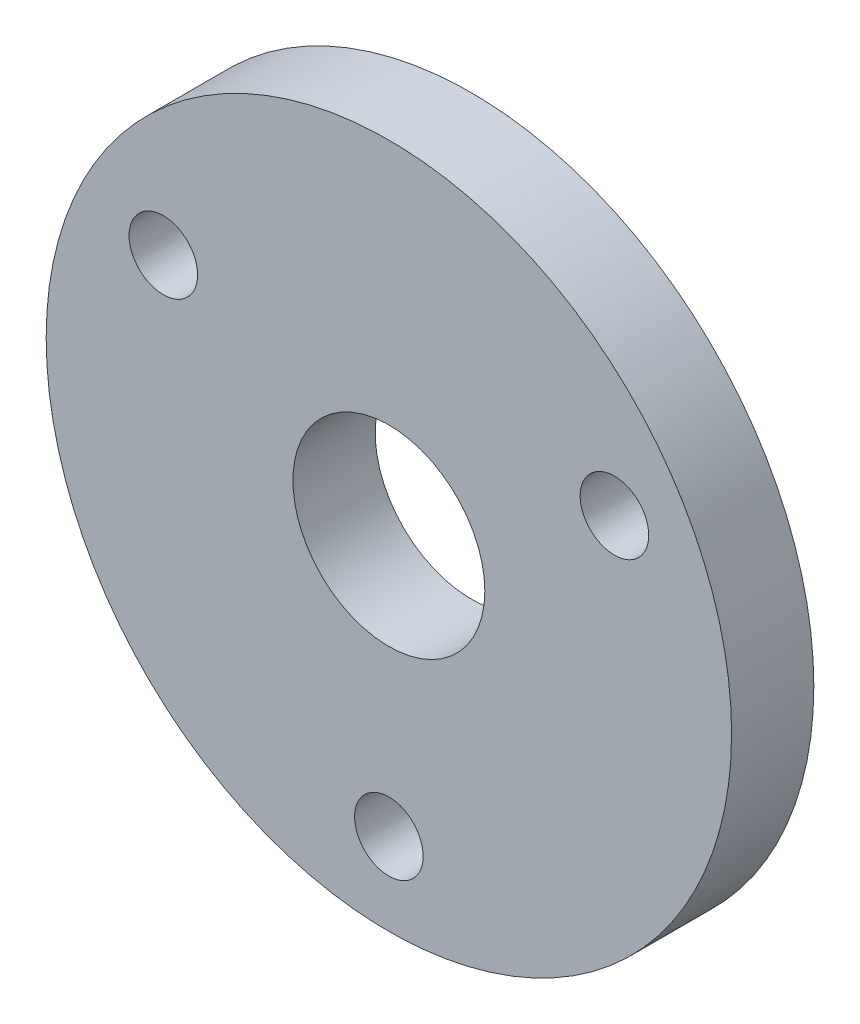
ISO-10303-21;
HEADER;
FILE_DESCRIPTION(('STEP AP214'),'2;1');
FILE_NAME('part.step','',(''),(''),'','','');
FILE_SCHEMA(('AUTOMOTIVE_DESIGN { 1 0 10303 214 1 1 1 1 }'));
ENDSEC;
DATA;
#1=APPLICATION_CONTEXT('core data for automotive mechanical design processes');
#2=APPLICATION_PROTOCOL_DEFINITION('international standard','automotive_design',2000,#1);
#3=PRODUCT_CONTEXT('',#1,'mechanical');
#4=PRODUCT('Part','Part','',(#3));
#5=PRODUCT_RELATED_PRODUCT_CATEGORY('part','',(#4));
#6=PRODUCT_DEFINITION_FORMATION('','',#4);
#7=PRODUCT_DEFINITION_CONTEXT('part definition',#1,'design');
#8=PRODUCT_DEFINITION('design','',#6,#7);
#9=PRODUCT_DEFINITION_SHAPE('','',#8);
#10=(LENGTH_UNIT() NAMED_UNIT(*) SI_UNIT(.MILLI.,.METRE.));
#11=(NAMED_UNIT(*) PLANE_ANGLE_UNIT() SI_UNIT($,.RADIAN.));
#12=(NAMED_UNIT(*) SI_UNIT($,.STERADIAN.) SOLID_ANGLE_UNIT());
#13=UNCERTAINTY_MEASURE_WITH_UNIT(LENGTH_MEASURE(1.E-05),#10,'distance_accuracy_value','');
#14=(GEOMETRIC_REPRESENTATION_CONTEXT(3) GLOBAL_UNCERTAINTY_ASSIGNED_CONTEXT((#13)) GLOBAL_UNIT_ASSIGNED_CONTEXT((#10,
#11,#12)) REPRESENTATION_CONTEXT('',''));
#15=CARTESIAN_POINT('',(0.,0.,0.));
#16=DIRECTION('',(0.,0.,1.));
#17=DIRECTION('',(1.,0.,0.));
#18=AXIS2_PLACEMENT_3D('',#15,#16,#17);
#19=CARTESIAN_POINT('',(0.,0.,6.00000000000001));
#20=DIRECTION('',(0.,0.,1.));
#21=DIRECTION('',(1.,0.,0.));
#22=AXIS2_PLACEMENT_3D('',#19,#20,#21);
#23=PLANE('',#22);
#24=CARTESIAN_POINT('',(-16.4544826719043,9.50000000000008,6.00000000000001));
#25=DIRECTION('',(0.,0.,1.));
#26=DIRECTION('',(1.,0.,0.));
#27=AXIS2_PLACEMENT_3D('',#24,#25,#26);
#28=CIRCLE('',#27,2.5);
#29=CARTESIAN_POINT('',(-13.9544826719043,9.50000000000008,6.00000000000001));
#30=VERTEX_POINT('',#29);
#31=EDGE_CURVE('E48',#30,#30,#28,.T.);
#32=ORIENTED_EDGE('',*,*,#31,.F.);
#33=EDGE_LOOP('',(#32));
#34=FACE_BOUND('',#33,.T.);
#35=CARTESIAN_POINT('',(0.,0.,6.00000000000001));
#36=DIRECTION('',(0.,0.,1.));
#37=DIRECTION('',(1.,0.,0.));
#38=AXIS2_PLACEMENT_3D('',#35,#36,#37);
#39=CIRCLE('',#38,7.);
#40=CARTESIAN_POINT('',(7.,0.,6.00000000000001));
#41=VERTEX_POINT('',#40);
#42=EDGE_CURVE('E37',#41,#41,#39,.T.);
#43=ORIENTED_EDGE('',*,*,#42,.F.);
#44=EDGE_LOOP('',(#43));
#45=FACE_BOUND('',#44,.T.);
#46=CARTESIAN_POINT('',(0.,0.,6.00000000000001));
#47=DIRECTION('',(0.,0.,1.));
#48=DIRECTION('',(1.,0.,0.));
#49=AXIS2_PLACEMENT_3D('',#46,#47,#48);
#50=CIRCLE('',#49,25.);
#51=CARTESIAN_POINT('',(25.,0.,6.00000000000001));
#52=VERTEX_POINT('',#51);
#53=EDGE_CURVE('E10',#52,#52,#50,.T.);
#54=ORIENTED_EDGE('',*,*,#53,.T.);
#55=EDGE_LOOP('',(#54));
#56=FACE_BOUND('',#55,.T.);
#57=CARTESIAN_POINT('',(0.,-19.,6.00000000000001));
#58=DIRECTION('',(0.,0.,1.));
#59=DIRECTION('',(1.,0.,0.));
#60=AXIS2_PLACEMENT_3D('',#57,#58,#59);
#61=CIRCLE('',#60,2.5);
#62=CARTESIAN_POINT('',(2.49999999999999,-19.,6.00000000000001));
#63=VERTEX_POINT('',#62);
#64=EDGE_CURVE('E42',#63,#63,#61,.T.);
#65=ORIENTED_EDGE('',*,*,#64,.F.);
#66=EDGE_LOOP('',(#65));
#67=FACE_BOUND('',#66,.T.);
#68=CARTESIAN_POINT('',(16.4544826719044,9.49999999999984,6.00000000000001));
#69=DIRECTION('',(0.,0.,1.));
#70=DIRECTION('',(1.,0.,0.));
#71=AXIS2_PLACEMENT_3D('',#68,#69,#70);
#72=CIRCLE('',#71,2.5);
#73=CARTESIAN_POINT('',(18.9544826719044,9.49999999999984,6.00000000000001));
#74=VERTEX_POINT('',#73);
#75=EDGE_CURVE('E54',#74,#74,#72,.T.);
#76=ORIENTED_EDGE('',*,*,#75,.F.);
#77=EDGE_LOOP('',(#76));
#78=FACE_BOUND('',#77,.T.);
#79=ADVANCED_FACE('F26',(#34,#45,#56,#67,#78),#23,.T.);
#80=CARTESIAN_POINT('',(0.,0.,0.));
#81=DIRECTION('',(0.,0.,1.));
#82=DIRECTION('',(1.,0.,0.));
#83=AXIS2_PLACEMENT_3D('',#80,#81,#82);
#84=PLANE('',#83);
#85=CARTESIAN_POINT('',(0.,0.,0.));
#86=DIRECTION('',(0.,0.,1.));
#87=DIRECTION('',(1.,0.,0.));
#88=AXIS2_PLACEMENT_3D('',#85,#86,#87);
#89=CIRCLE('',#88,25.);
#90=CARTESIAN_POINT('',(25.,0.,0.));
#91=VERTEX_POINT('',#90);
#92=EDGE_CURVE('E30',#91,#91,#89,.T.);
#93=ORIENTED_EDGE('',*,*,#92,.F.);
#94=EDGE_LOOP('',(#93));
#95=FACE_BOUND('',#94,.T.);
#96=CARTESIAN_POINT('',(0.,0.,0.));
#97=DIRECTION('',(0.,0.,1.));
#98=DIRECTION('',(1.,0.,0.));
#99=AXIS2_PLACEMENT_3D('',#96,#97,#98);
#100=CIRCLE('',#99,7.);
#101=CARTESIAN_POINT('',(7.,0.,0.));
#102=VERTEX_POINT('',#101);
#103=EDGE_CURVE('E39',#102,#102,#100,.T.);
#104=ORIENTED_EDGE('',*,*,#103,.T.);
#105=EDGE_LOOP('',(#104));
#106=FACE_BOUND('',#105,.T.);
#107=CARTESIAN_POINT('',(0.,-19.,0.));
#108=DIRECTION('',(0.,0.,1.));
#109=DIRECTION('',(1.,0.,0.));
#110=AXIS2_PLACEMENT_3D('',#107,#108,#109);
#111=CIRCLE('',#110,2.5);
#112=CARTESIAN_POINT('',(2.49999999999999,-19.,0.));
#113=VERTEX_POINT('',#112);
#114=EDGE_CURVE('E45',#113,#113,#111,.T.);
#115=ORIENTED_EDGE('',*,*,#114,.T.);
#116=EDGE_LOOP('',(#115));
#117=FACE_BOUND('',#116,.T.);
#118=CARTESIAN_POINT('',(-16.4544826719043,9.50000000000008,0.));
#119=DIRECTION('',(0.,0.,1.));
#120=DIRECTION('',(1.,0.,0.));
#121=AXIS2_PLACEMENT_3D('',#118,#119,#120);
#122=CIRCLE('',#121,2.5);
#123=CARTESIAN_POINT('',(-13.9544826719043,9.50000000000008,0.));
#124=VERTEX_POINT('',#123);
#125=EDGE_CURVE('E51',#124,#124,#122,.T.);
#126=ORIENTED_EDGE('',*,*,#125,.T.);
#127=EDGE_LOOP('',(#126));
#128=FACE_BOUND('',#127,.T.);
#129=CARTESIAN_POINT('',(16.4544826719044,9.49999999999984,0.));
#130=DIRECTION('',(0.,0.,1.));
#131=DIRECTION('',(1.,0.,0.));
#132=AXIS2_PLACEMENT_3D('',#129,#130,#131);
#133=CIRCLE('',#132,2.5);
#134=CARTESIAN_POINT('',(18.9544826719044,9.49999999999984,0.));
#135=VERTEX_POINT('',#134);
#136=EDGE_CURVE('E57',#135,#135,#133,.T.);
#137=ORIENTED_EDGE('',*,*,#136,.T.);
#138=EDGE_LOOP('',(#137));
#139=FACE_BOUND('',#138,.T.);
#140=ADVANCED_FACE('F67',(#95,#106,#117,#128,#139),#84,.F.);
#141=CARTESIAN_POINT('',(0.,0.,6.00000000000001));
#142=DIRECTION('',(0.,0.,-1.));
#143=DIRECTION('',(-1.,0.,0.));
#144=AXIS2_PLACEMENT_3D('',#141,#142,#143);
#145=CYLINDRICAL_SURFACE('',#144,25.);
#146=ORIENTED_EDGE('',*,*,#53,.F.);
#147=EDGE_LOOP('',(#146));
#148=FACE_BOUND('',#147,.T.);
#149=ORIENTED_EDGE('',*,*,#92,.T.);
#150=EDGE_LOOP('',(#149));
#151=FACE_BOUND('',#150,.T.);
#152=ADVANCED_FACE('F28',(#148,#151),#145,.T.);
#153=CARTESIAN_POINT('',(0.,0.,6.00000000000001));
#154=DIRECTION('',(0.,0.,-1.));
#155=DIRECTION('',(-1.,0.,0.));
#156=AXIS2_PLACEMENT_3D('',#153,#154,#155);
#157=CYLINDRICAL_SURFACE('',#156,7.);
#158=ORIENTED_EDGE('',*,*,#42,.T.);
#159=EDGE_LOOP('',(#158));
#160=FACE_BOUND('',#159,.T.);
#161=ORIENTED_EDGE('',*,*,#103,.F.);
#162=EDGE_LOOP('',(#161));
#163=FACE_BOUND('',#162,.T.);
#164=ADVANCED_FACE('F77',(#160,#163),#157,.F.);
#165=CARTESIAN_POINT('',(0.,-19.,6.00000000000001));
#166=DIRECTION('',(0.,0.,-1.));
#167=DIRECTION('',(-1.,0.,0.));
#168=AXIS2_PLACEMENT_3D('',#165,#166,#167);
#169=CYLINDRICAL_SURFACE('',#168,2.5);
#170=ORIENTED_EDGE('',*,*,#64,.T.);
#171=EDGE_LOOP('',(#170));
#172=FACE_BOUND('',#171,.T.);
#173=ORIENTED_EDGE('',*,*,#114,.F.);
#174=EDGE_LOOP('',(#173));
#175=FACE_BOUND('',#174,.T.);
#176=ADVANCED_FACE('F80',(#172,#175),#169,.F.);
#177=CARTESIAN_POINT('',(-16.4544826719043,9.50000000000008,6.00000000000001));
#178=DIRECTION('',(0.,0.,-1.));
#179=DIRECTION('',(-1.,0.,0.));
#180=AXIS2_PLACEMENT_3D('',#177,#178,#179);
#181=CYLINDRICAL_SURFACE('',#180,2.5);
#182=ORIENTED_EDGE('',*,*,#31,.T.);
#183=EDGE_LOOP('',(#182));
#184=FACE_BOUND('',#183,.T.);
#185=ORIENTED_EDGE('',*,*,#125,.F.);
#186=EDGE_LOOP('',(#185));
#187=FACE_BOUND('',#186,.T.);
#188=ADVANCED_FACE('F84',(#184,#187),#181,.F.);
#189=CARTESIAN_POINT('',(16.4544826719044,9.49999999999984,6.00000000000001));
#190=DIRECTION('',(0.,0.,-1.));
#191=DIRECTION('',(-1.,0.,0.));
#192=AXIS2_PLACEMENT_3D('',#189,#190,#191);
#193=CYLINDRICAL_SURFACE('',#192,2.5);
#194=ORIENTED_EDGE('',*,*,#75,.T.);
#195=EDGE_LOOP('',(#194));
#196=FACE_BOUND('',#195,.T.);
#197=ORIENTED_EDGE('',*,*,#136,.F.);
#198=EDGE_LOOP('',(#197));
#199=FACE_BOUND('',#198,.T.);
#200=ADVANCED_FACE('F63',(#196,#199),#193,.F.);
#201=CLOSED_SHELL('',(#79,#140,#152,#164,#176,#188,#200));
#202=MANIFOLD_SOLID_BREP('B2',#201);
#203=ADVANCED_BREP_SHAPE_REPRESENTATION('',(#18,#202),#14);
#204=SHAPE_DEFINITION_REPRESENTATION(#9,#203);
ENDSEC;
END-ISO-10303-21;
